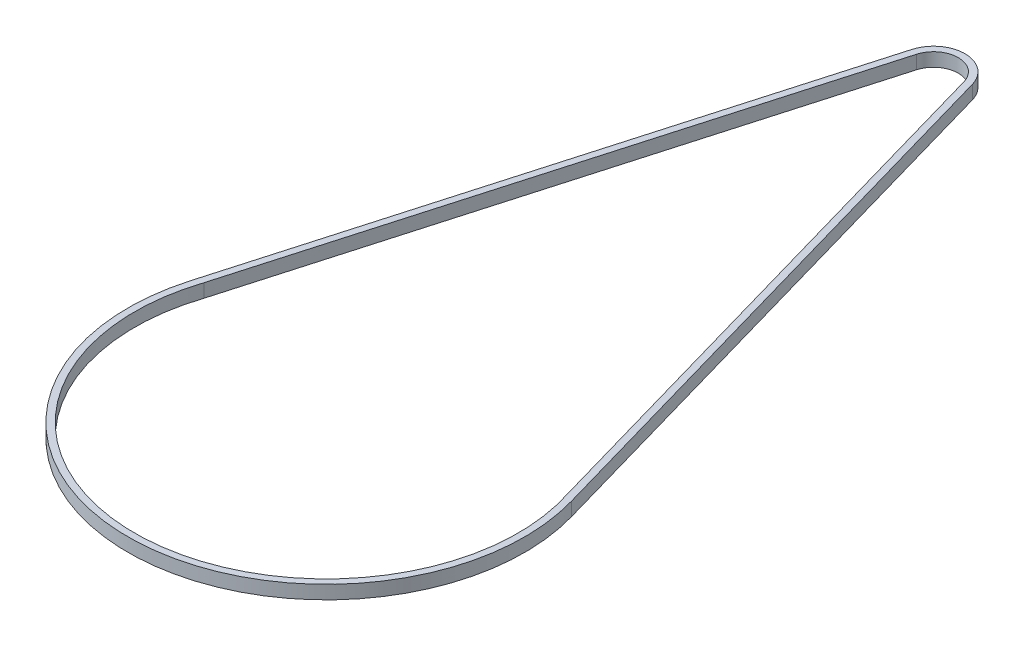
ISO-10303-21;
HEADER;
FILE_DESCRIPTION(('STEP AP214'),'2;1');
FILE_NAME('part.step','',(''),(''),'','','');
FILE_SCHEMA(('AUTOMOTIVE_DESIGN { 1 0 10303 214 1 1 1 1 }'));
ENDSEC;
DATA;
#1=APPLICATION_CONTEXT('core data for automotive mechanical design processes');
#2=APPLICATION_PROTOCOL_DEFINITION('international standard','automotive_design',2000,#1);
#3=PRODUCT_CONTEXT('',#1,'mechanical');
#4=PRODUCT('Part','Part','',(#3));
#5=PRODUCT_RELATED_PRODUCT_CATEGORY('part','',(#4));
#6=PRODUCT_DEFINITION_FORMATION('','',#4);
#7=PRODUCT_DEFINITION_CONTEXT('part definition',#1,'design');
#8=PRODUCT_DEFINITION('design','',#6,#7);
#9=PRODUCT_DEFINITION_SHAPE('','',#8);
#10=(LENGTH_UNIT() NAMED_UNIT(*) SI_UNIT(.MILLI.,.METRE.));
#11=(NAMED_UNIT(*) PLANE_ANGLE_UNIT() SI_UNIT($,.RADIAN.));
#12=(NAMED_UNIT(*) SI_UNIT($,.STERADIAN.) SOLID_ANGLE_UNIT());
#13=UNCERTAINTY_MEASURE_WITH_UNIT(LENGTH_MEASURE(1.E-05),#10,'distance_accuracy_value','');
#14=(GEOMETRIC_REPRESENTATION_CONTEXT(3) GLOBAL_UNCERTAINTY_ASSIGNED_CONTEXT((#13)) GLOBAL_UNIT_ASSIGNED_CONTEXT((#10,
#11,#12)) REPRESENTATION_CONTEXT('',''));
#15=CARTESIAN_POINT('',(0.,0.,0.));
#16=DIRECTION('',(0.,0.,1.));
#17=DIRECTION('',(1.,0.,0.));
#18=AXIS2_PLACEMENT_3D('',#15,#16,#17);
#19=CARTESIAN_POINT('',(0.,35.,0.));
#20=DIRECTION('',(0.,-1.,0.));
#21=DIRECTION('',(0.,0.,-1.));
#22=AXIS2_PLACEMENT_3D('',#19,#20,#21);
#23=CYLINDRICAL_SURFACE('',#22,71.05);
#24=CARTESIAN_POINT('',(0.,5.,0.));
#25=DIRECTION('',(0.,1.,0.));
#26=DIRECTION('',(0.,0.,1.));
#27=AXIS2_PLACEMENT_3D('',#24,#25,#26);
#28=CIRCLE('',#27,71.05);
#29=CARTESIAN_POINT('',(67.4921652069034,5.,-22.2015795763288));
#30=VERTEX_POINT('',#29);
#31=CARTESIAN_POINT('',(-67.4921652069038,5.,-22.2015795763277));
#32=VERTEX_POINT('',#31);
#33=EDGE_CURVE('E12',#30,#32,#28,.F.);
#34=ORIENTED_EDGE('',*,*,#33,.F.);
#35=DIRECTION('',(0.,-1.,0.));
#36=VECTOR('',#35,1.);
#37=CARTESIAN_POINT('',(67.4921652069034,35.,-22.2015795763287));
#38=LINE('',#37,#36);
#39=CARTESIAN_POINT('',(67.4921652069034,0.,-22.2015795763287));
#40=VERTEX_POINT('',#39);
#41=EDGE_CURVE('E74',#40,#30,#38,.F.);
#42=ORIENTED_EDGE('',*,*,#41,.F.);
#43=CARTESIAN_POINT('',(0.,0.,0.));
#44=DIRECTION('',(0.,-1.,0.));
#45=DIRECTION('',(0.,0.,-1.));
#46=AXIS2_PLACEMENT_3D('',#43,#44,#45);
#47=CIRCLE('',#46,71.05);
#48=CARTESIAN_POINT('',(-67.4921652069037,0.,-22.2015795763277));
#49=VERTEX_POINT('',#48);
#50=EDGE_CURVE('E137',#40,#49,#47,.T.);
#51=ORIENTED_EDGE('',*,*,#50,.T.);
#52=DIRECTION('',(0.,-1.,0.));
#53=VECTOR('',#52,1.);
#54=CARTESIAN_POINT('',(-67.4921652069038,35.,-22.2015795763277));
#55=LINE('',#54,#53);
#56=EDGE_CURVE('E145',#49,#32,#55,.F.);
#57=ORIENTED_EDGE('',*,*,#56,.T.);
#58=EDGE_LOOP('',(#34,#42,#51,#57));
#59=FACE_BOUND('',#58,.T.);
#60=ADVANCED_FACE('F66',(#59),#23,.F.);
#61=CARTESIAN_POINT('',(0.,0.,0.));
#62=DIRECTION('',(0.,-1.,0.));
#63=DIRECTION('',(0.,0.,-1.));
#64=AXIS2_PLACEMENT_3D('',#61,#62,#63);
#65=PLANE('',#64);
#66=ORIENTED_EDGE('',*,*,#50,.F.);
#67=DIRECTION('',(-0.274866666666667,0.,-0.961482353221085));
#68=VECTOR('',#67,1.);
#69=CARTESIAN_POINT('',(68.2604396669309,0.,-19.514159));
#70=LINE('',#69,#68);
#71=CARTESIAN_POINT('',(8.79756353197293,0.,-227.51503));
#72=VERTEX_POINT('',#71);
#73=EDGE_CURVE('E155',#40,#72,#70,.T.);
#74=ORIENTED_EDGE('',*,*,#73,.T.);
#75=CARTESIAN_POINT('',(0.,0.,-225.));
#76=DIRECTION('',(0.,-1.,0.));
#77=DIRECTION('',(0.,0.,-1.));
#78=AXIS2_PLACEMENT_3D('',#75,#76,#77);
#79=CIRCLE('',#78,9.15);
#80=CARTESIAN_POINT('',(-8.79756353197289,0.,-227.51503));
#81=VERTEX_POINT('',#80);
#82=EDGE_CURVE('E88',#81,#72,#79,.T.);
#83=ORIENTED_EDGE('',*,*,#82,.F.);
#84=DIRECTION('',(0.274866666666667,0.,-0.961482353221085));
#85=VECTOR('',#84,1.);
#86=CARTESIAN_POINT('',(-68.260439666931,0.,-19.514159));
#87=LINE('',#86,#85);
#88=EDGE_CURVE('E149',#49,#81,#87,.T.);
#89=ORIENTED_EDGE('',*,*,#88,.F.);
#90=EDGE_LOOP('',(#66,#74,#83,#89));
#91=FACE_BOUND('',#90,.T.);
#92=CARTESIAN_POINT('',(0.,0.,0.));
#93=DIRECTION('',(0.,-1.,0.));
#94=DIRECTION('',(0.,0.,-1.));
#95=AXIS2_PLACEMENT_3D('',#92,#93,#94);
#96=CIRCLE('',#95,73.5);
#97=CARTESIAN_POINT('',(70.6684860072406,0.,-20.2043333333333));
#98=VERTEX_POINT('',#97);
#99=CARTESIAN_POINT('',(-70.6684860072406,0.,-20.2043333333333));
#100=VERTEX_POINT('',#99);
#101=EDGE_CURVE('E159',#98,#100,#96,.T.);
#102=ORIENTED_EDGE('',*,*,#101,.T.);
#103=DIRECTION('',(0.274888888888889,0.,-0.961476000098511));
#104=VECTOR('',#103,1.);
#105=CARTESIAN_POINT('',(-70.6684860072406,0.,-20.2043333333333));
#106=LINE('',#105,#104);
#107=CARTESIAN_POINT('',(-11.2011954011476,0.,-228.202455555556));
#108=VERTEX_POINT('',#107);
#109=EDGE_CURVE('E162',#100,#108,#106,.T.);
#110=ORIENTED_EDGE('',*,*,#109,.T.);
#111=CARTESIAN_POINT('',(0.,0.,-225.));
#112=DIRECTION('',(0.,-1.,0.));
#113=DIRECTION('',(0.,0.,-1.));
#114=AXIS2_PLACEMENT_3D('',#111,#112,#113);
#115=CIRCLE('',#114,11.65);
#116=CARTESIAN_POINT('',(11.2011954011477,0.,-228.202455555556));
#117=VERTEX_POINT('',#116);
#118=EDGE_CURVE('E165',#108,#117,#115,.T.);
#119=ORIENTED_EDGE('',*,*,#118,.T.);
#120=DIRECTION('',(-0.274888888888889,0.,-0.961476000098511));
#121=VECTOR('',#120,1.);
#122=CARTESIAN_POINT('',(70.6684860072406,0.,-20.2043333333333));
#123=LINE('',#122,#121);
#124=EDGE_CURVE('E167',#98,#117,#123,.T.);
#125=ORIENTED_EDGE('',*,*,#124,.F.);
#126=EDGE_LOOP('',(#102,#110,#119,#125));
#127=FACE_BOUND('',#126,.T.);
#128=ADVANCED_FACE('F193',(#91,#127),#65,.T.);
#129=CARTESIAN_POINT('',(0.,5.,0.));
#130=DIRECTION('',(0.,-1.,0.));
#131=DIRECTION('',(0.,0.,-1.));
#132=AXIS2_PLACEMENT_3D('',#129,#130,#131);
#133=PLANE('',#132);
#134=DIRECTION('',(0.274866666666667,0.,-0.961482353221085));
#135=VECTOR('',#134,1.);
#136=CARTESIAN_POINT('',(-68.260439666931,5.,-19.514159));
#137=LINE('',#136,#135);
#138=CARTESIAN_POINT('',(-8.79756353197289,5.,-227.51503));
#139=VERTEX_POINT('',#138);
#140=EDGE_CURVE('E139',#32,#139,#137,.T.);
#141=ORIENTED_EDGE('',*,*,#140,.T.);
#142=CARTESIAN_POINT('',(0.,5.,-225.));
#143=DIRECTION('',(0.,-1.,0.));
#144=DIRECTION('',(0.,0.,-1.));
#145=AXIS2_PLACEMENT_3D('',#142,#143,#144);
#146=CIRCLE('',#145,9.14999999999998);
#147=CARTESIAN_POINT('',(8.79756353197293,5.,-227.51503));
#148=VERTEX_POINT('',#147);
#149=EDGE_CURVE('E129',#148,#139,#146,.F.);
#150=ORIENTED_EDGE('',*,*,#149,.F.);
#151=DIRECTION('',(-0.274866666666667,0.,-0.961482353221085));
#152=VECTOR('',#151,1.);
#153=CARTESIAN_POINT('',(68.2604396669309,5.,-19.514159));
#154=LINE('',#153,#152);
#155=EDGE_CURVE('E80',#30,#148,#154,.T.);
#156=ORIENTED_EDGE('',*,*,#155,.F.);
#157=ORIENTED_EDGE('',*,*,#33,.T.);
#158=EDGE_LOOP('',(#141,#150,#156,#157));
#159=FACE_BOUND('',#158,.T.);
#160=DIRECTION('',(-0.274888888888889,0.,-0.961476000098511));
#161=VECTOR('',#160,1.);
#162=CARTESIAN_POINT('',(70.6684860072406,5.,-20.2043333333333));
#163=LINE('',#162,#161);
#164=CARTESIAN_POINT('',(70.6684860072406,5.,-20.2043333333333));
#165=VERTEX_POINT('',#164);
#166=CARTESIAN_POINT('',(11.2011954011477,5.,-228.202455555556));
#167=VERTEX_POINT('',#166);
#168=EDGE_CURVE('E163',#165,#167,#163,.T.);
#169=ORIENTED_EDGE('',*,*,#168,.T.);
#170=CARTESIAN_POINT('',(0.,5.,-225.));
#171=DIRECTION('',(0.,-1.,0.));
#172=DIRECTION('',(0.,0.,-1.));
#173=AXIS2_PLACEMENT_3D('',#170,#171,#172);
#174=CIRCLE('',#173,11.65);
#175=CARTESIAN_POINT('',(-11.2011954011476,5.,-228.202455555556));
#176=VERTEX_POINT('',#175);
#177=EDGE_CURVE('E172',#176,#167,#174,.T.);
#178=ORIENTED_EDGE('',*,*,#177,.F.);
#179=DIRECTION('',(0.274888888888889,0.,-0.961476000098511));
#180=VECTOR('',#179,1.);
#181=CARTESIAN_POINT('',(-70.6684860072406,5.,-20.2043333333333));
#182=LINE('',#181,#180);
#183=CARTESIAN_POINT('',(-70.6684860072406,5.,-20.2043333333333));
#184=VERTEX_POINT('',#183);
#185=EDGE_CURVE('E153',#184,#176,#182,.T.);
#186=ORIENTED_EDGE('',*,*,#185,.F.);
#187=CARTESIAN_POINT('',(0.,5.,0.));
#188=DIRECTION('',(0.,-1.,0.));
#189=DIRECTION('',(0.,0.,-1.));
#190=AXIS2_PLACEMENT_3D('',#187,#188,#189);
#191=CIRCLE('',#190,73.5);
#192=EDGE_CURVE('E150',#165,#184,#191,.T.);
#193=ORIENTED_EDGE('',*,*,#192,.F.);
#194=EDGE_LOOP('',(#169,#178,#186,#193));
#195=FACE_BOUND('',#194,.T.);
#196=ADVANCED_FACE('F140',(#159,#195),#133,.F.);
#197=CARTESIAN_POINT('',(0.,0.,0.));
#198=DIRECTION('',(0.,1.,0.));
#199=DIRECTION('',(0.,0.,1.));
#200=AXIS2_PLACEMENT_3D('',#197,#198,#199);
#201=CYLINDRICAL_SURFACE('',#200,73.5);
#202=ORIENTED_EDGE('',*,*,#192,.T.);
#203=DIRECTION('',(0.,1.,0.));
#204=VECTOR('',#203,1.);
#205=CARTESIAN_POINT('',(-70.6684860072406,0.,-20.2043333333333));
#206=LINE('',#205,#204);
#207=EDGE_CURVE('E184',#100,#184,#206,.T.);
#208=ORIENTED_EDGE('',*,*,#207,.F.);
#209=ORIENTED_EDGE('',*,*,#101,.F.);
#210=DIRECTION('',(0.,1.,0.));
#211=VECTOR('',#210,1.);
#212=CARTESIAN_POINT('',(70.6684860072406,0.,-20.2043333333333));
#213=LINE('',#212,#211);
#214=EDGE_CURVE('E169',#98,#165,#213,.T.);
#215=ORIENTED_EDGE('',*,*,#214,.T.);
#216=EDGE_LOOP('',(#202,#208,#209,#215));
#217=FACE_BOUND('',#216,.T.);
#218=ADVANCED_FACE('F68',(#217),#201,.T.);
#219=CARTESIAN_POINT('',(-70.6684860072406,0.,-20.2043333333333));
#220=DIRECTION('',(0.961476000098511,0.,0.274888888888889));
#221=DIRECTION('',(0.274888888888889,0.,-0.961476000098511));
#222=AXIS2_PLACEMENT_3D('',#219,#220,#221);
#223=PLANE('',#222);
#224=ORIENTED_EDGE('',*,*,#185,.T.);
#225=DIRECTION('',(0.,1.,0.));
#226=VECTOR('',#225,1.);
#227=CARTESIAN_POINT('',(-11.2011954011476,0.,-228.202455555556));
#228=LINE('',#227,#226);
#229=EDGE_CURVE('E181',#108,#176,#228,.T.);
#230=ORIENTED_EDGE('',*,*,#229,.F.);
#231=ORIENTED_EDGE('',*,*,#109,.F.);
#232=ORIENTED_EDGE('',*,*,#207,.T.);
#233=EDGE_LOOP('',(#224,#230,#231,#232));
#234=FACE_BOUND('',#233,.T.);
#235=ADVANCED_FACE('F208',(#234),#223,.F.);
#236=CARTESIAN_POINT('',(0.,0.,-225.));
#237=DIRECTION('',(0.,1.,0.));
#238=DIRECTION('',(0.,0.,1.));
#239=AXIS2_PLACEMENT_3D('',#236,#237,#238);
#240=CYLINDRICAL_SURFACE('',#239,11.65);
#241=ORIENTED_EDGE('',*,*,#177,.T.);
#242=DIRECTION('',(0.,1.,0.));
#243=VECTOR('',#242,1.);
#244=CARTESIAN_POINT('',(11.2011954011477,0.,-228.202455555556));
#245=LINE('',#244,#243);
#246=EDGE_CURVE('E178',#117,#167,#245,.T.);
#247=ORIENTED_EDGE('',*,*,#246,.F.);
#248=ORIENTED_EDGE('',*,*,#118,.F.);
#249=ORIENTED_EDGE('',*,*,#229,.T.);
#250=EDGE_LOOP('',(#241,#247,#248,#249));
#251=FACE_BOUND('',#250,.T.);
#252=ADVANCED_FACE('F213',(#251),#240,.T.);
#253=CARTESIAN_POINT('',(70.6684860072406,0.,-20.2043333333333));
#254=DIRECTION('',(0.961476000098511,0.,-0.274888888888889));
#255=DIRECTION('',(-0.274888888888889,0.,-0.961476000098511));
#256=AXIS2_PLACEMENT_3D('',#253,#254,#255);
#257=PLANE('',#256);
#258=ORIENTED_EDGE('',*,*,#168,.F.);
#259=ORIENTED_EDGE('',*,*,#214,.F.);
#260=ORIENTED_EDGE('',*,*,#124,.T.);
#261=ORIENTED_EDGE('',*,*,#246,.T.);
#262=EDGE_LOOP('',(#258,#259,#260,#261));
#263=FACE_BOUND('',#262,.T.);
#264=ADVANCED_FACE('F216',(#263),#257,.T.);
#265=CARTESIAN_POINT('',(-68.260439666931,0.,-19.514159));
#266=DIRECTION('',(0.961482353221085,0.,0.274866666666667));
#267=DIRECTION('',(0.274866666666667,0.,-0.961482353221085));
#268=AXIS2_PLACEMENT_3D('',#265,#266,#267);
#269=PLANE('',#268);
#270=ORIENTED_EDGE('',*,*,#56,.F.);
#271=ORIENTED_EDGE('',*,*,#88,.T.);
#272=DIRECTION('',(0.,1.,0.));
#273=VECTOR('',#272,1.);
#274=CARTESIAN_POINT('',(-8.7975635319729,0.,-227.51503));
#275=LINE('',#274,#273);
#276=EDGE_CURVE('E133',#81,#139,#275,.T.);
#277=ORIENTED_EDGE('',*,*,#276,.T.);
#278=ORIENTED_EDGE('',*,*,#140,.F.);
#279=EDGE_LOOP('',(#270,#271,#277,#278));
#280=FACE_BOUND('',#279,.T.);
#281=ADVANCED_FACE('F147',(#280),#269,.T.);
#282=CARTESIAN_POINT('',(68.2604396669309,0.,-19.514159));
#283=DIRECTION('',(0.961482353221085,0.,-0.274866666666667));
#284=DIRECTION('',(-0.274866666666667,0.,-0.961482353221085));
#285=AXIS2_PLACEMENT_3D('',#282,#283,#284);
#286=PLANE('',#285);
#287=ORIENTED_EDGE('',*,*,#73,.F.);
#288=ORIENTED_EDGE('',*,*,#41,.T.);
#289=ORIENTED_EDGE('',*,*,#155,.T.);
#290=DIRECTION('',(0.,1.,0.));
#291=VECTOR('',#290,1.);
#292=CARTESIAN_POINT('',(8.79756353197294,0.,-227.51503));
#293=LINE('',#292,#291);
#294=EDGE_CURVE('E136',#72,#148,#293,.T.);
#295=ORIENTED_EDGE('',*,*,#294,.F.);
#296=EDGE_LOOP('',(#287,#288,#289,#295));
#297=FACE_BOUND('',#296,.T.);
#298=ADVANCED_FACE('F189',(#297),#286,.F.);
#299=CARTESIAN_POINT('',(0.,30.8801081914276,-225.));
#300=DIRECTION('',(0.,-1.,0.));
#301=DIRECTION('',(0.,0.,-1.));
#302=AXIS2_PLACEMENT_3D('',#299,#300,#301);
#303=CYLINDRICAL_SURFACE('',#302,9.14999999999998);
#304=ORIENTED_EDGE('',*,*,#276,.F.);
#305=ORIENTED_EDGE('',*,*,#82,.T.);
#306=ORIENTED_EDGE('',*,*,#294,.T.);
#307=ORIENTED_EDGE('',*,*,#149,.T.);
#308=EDGE_LOOP('',(#304,#305,#306,#307));
#309=FACE_BOUND('',#308,.T.);
#310=ADVANCED_FACE('F131',(#309),#303,.F.);
#311=CLOSED_SHELL('',(#60,#128,#196,#218,#235,#252,#264,#281,#298,#310));
#312=MANIFOLD_SOLID_BREP('B2',#311);
#313=ADVANCED_BREP_SHAPE_REPRESENTATION('',(#18,#312),#14);
#314=SHAPE_DEFINITION_REPRESENTATION(#9,#313);
ENDSEC;
END-ISO-10303-21;
